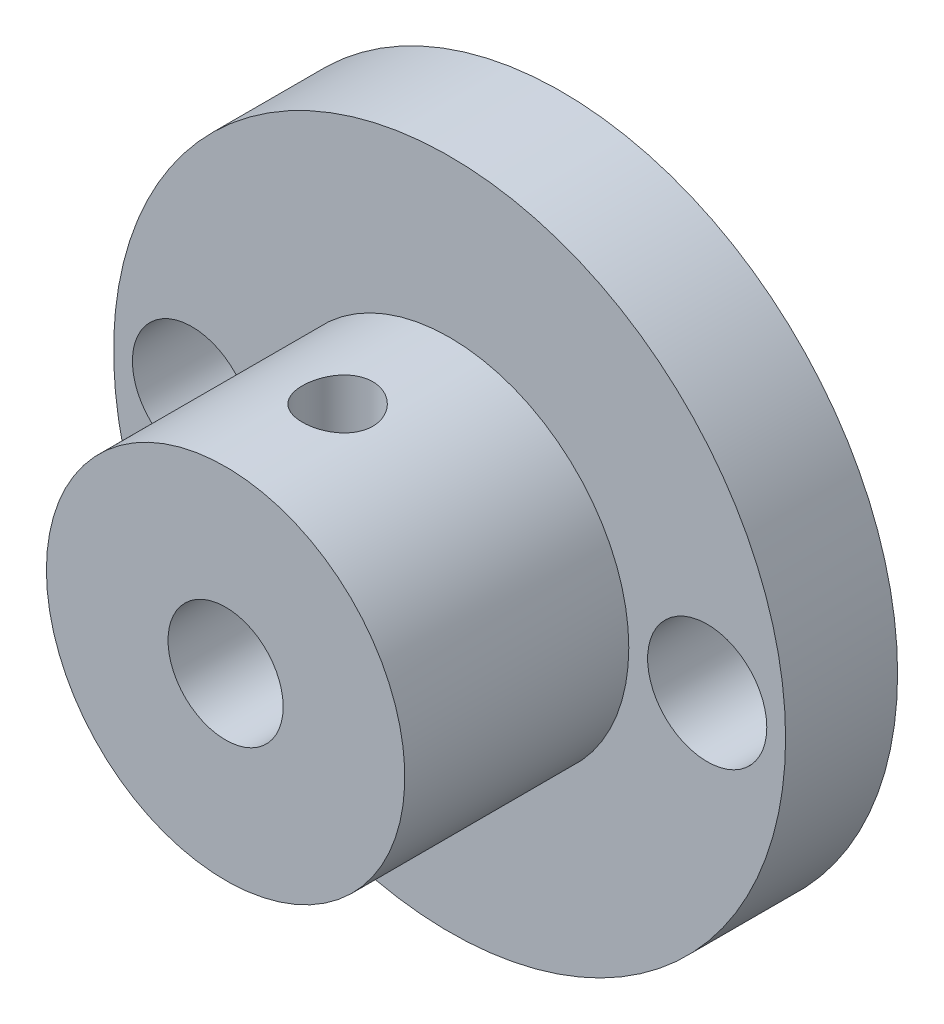
ISO-10303-21;
HEADER;
FILE_DESCRIPTION(('STEP AP214'),'2;1');
FILE_NAME('part.step','',(''),(''),'','','');
FILE_SCHEMA(('AUTOMOTIVE_DESIGN { 1 0 10303 214 1 1 1 1 }'));
ENDSEC;
DATA;
#1=APPLICATION_CONTEXT('core data for automotive mechanical design processes');
#2=APPLICATION_PROTOCOL_DEFINITION('international standard','automotive_design',2000,#1);
#3=PRODUCT_CONTEXT('',#1,'mechanical');
#4=PRODUCT('Part','Part','',(#3));
#5=PRODUCT_RELATED_PRODUCT_CATEGORY('part','',(#4));
#6=PRODUCT_DEFINITION_FORMATION('','',#4);
#7=PRODUCT_DEFINITION_CONTEXT('part definition',#1,'design');
#8=PRODUCT_DEFINITION('design','',#6,#7);
#9=PRODUCT_DEFINITION_SHAPE('','',#8);
#10=(LENGTH_UNIT() NAMED_UNIT(*) SI_UNIT(.MILLI.,.METRE.));
#11=(NAMED_UNIT(*) PLANE_ANGLE_UNIT() SI_UNIT($,.RADIAN.));
#12=(NAMED_UNIT(*) SI_UNIT($,.STERADIAN.) SOLID_ANGLE_UNIT());
#13=UNCERTAINTY_MEASURE_WITH_UNIT(LENGTH_MEASURE(1.E-05),#10,'distance_accuracy_value','');
#14=(GEOMETRIC_REPRESENTATION_CONTEXT(3) GLOBAL_UNCERTAINTY_ASSIGNED_CONTEXT((#13)) GLOBAL_UNIT_ASSIGNED_CONTEXT((#10,
#11,#12)) REPRESENTATION_CONTEXT('',''));
#15=CARTESIAN_POINT('',(0.,0.,0.));
#16=DIRECTION('',(0.,0.,1.));
#17=DIRECTION('',(1.,0.,0.));
#18=AXIS2_PLACEMENT_3D('',#15,#16,#17);
#19=CARTESIAN_POINT('',(0.,0.,6.35));
#20=DIRECTION('',(0.,0.,-1.));
#21=DIRECTION('',(-1.,0.,0.));
#22=AXIS2_PLACEMENT_3D('',#19,#20,#21);
#23=CYLINDRICAL_SURFACE('',#22,19.05);
#24=CARTESIAN_POINT('',(0.,0.,6.35));
#25=DIRECTION('',(0.,0.,1.));
#26=DIRECTION('',(1.,0.,0.));
#27=AXIS2_PLACEMENT_3D('',#24,#25,#26);
#28=CIRCLE('',#27,19.05);
#29=CARTESIAN_POINT('',(19.05,0.,6.35));
#30=VERTEX_POINT('',#29);
#31=EDGE_CURVE('E48',#30,#30,#28,.T.);
#32=ORIENTED_EDGE('',*,*,#31,.F.);
#33=EDGE_LOOP('',(#32));
#34=FACE_BOUND('',#33,.T.);
#35=CARTESIAN_POINT('',(0.,0.,0.));
#36=DIRECTION('',(0.,0.,1.));
#37=DIRECTION('',(1.,0.,0.));
#38=AXIS2_PLACEMENT_3D('',#35,#36,#37);
#39=CIRCLE('',#38,19.05);
#40=CARTESIAN_POINT('',(19.05,0.,0.));
#41=VERTEX_POINT('',#40);
#42=EDGE_CURVE('E53',#41,#41,#39,.T.);
#43=ORIENTED_EDGE('',*,*,#42,.T.);
#44=EDGE_LOOP('',(#43));
#45=FACE_BOUND('',#44,.T.);
#46=ADVANCED_FACE('F33',(#34,#45),#23,.T.);
#47=CARTESIAN_POINT('',(0.,0.,6.35));
#48=DIRECTION('',(0.,0.,1.));
#49=DIRECTION('',(1.,0.,0.));
#50=AXIS2_PLACEMENT_3D('',#47,#48,#49);
#51=PLANE('',#50);
#52=CARTESIAN_POINT('',(-14.605,0.,6.35));
#53=DIRECTION('',(0.,0.,1.));
#54=DIRECTION('',(1.,0.,0.));
#55=AXIS2_PLACEMENT_3D('',#52,#53,#54);
#56=CIRCLE('',#55,3.3782);
#57=CARTESIAN_POINT('',(-11.2268,0.,6.35));
#58=VERTEX_POINT('',#57);
#59=EDGE_CURVE('E183',#58,#58,#56,.T.);
#60=ORIENTED_EDGE('',*,*,#59,.F.);
#61=EDGE_LOOP('',(#60));
#62=FACE_BOUND('',#61,.T.);
#63=CARTESIAN_POINT('',(14.605,0.,6.35));
#64=DIRECTION('',(0.,0.,1.));
#65=DIRECTION('',(1.,0.,0.));
#66=AXIS2_PLACEMENT_3D('',#63,#64,#65);
#67=CIRCLE('',#66,3.3782);
#68=CARTESIAN_POINT('',(17.9832,0.,6.35));
#69=VERTEX_POINT('',#68);
#70=EDGE_CURVE('E187',#69,#69,#67,.T.);
#71=ORIENTED_EDGE('',*,*,#70,.F.);
#72=EDGE_LOOP('',(#71));
#73=FACE_BOUND('',#72,.T.);
#74=CARTESIAN_POINT('',(0.,0.,6.35));
#75=DIRECTION('',(0.,0.,1.));
#76=DIRECTION('',(1.,0.,0.));
#77=AXIS2_PLACEMENT_3D('',#74,#75,#76);
#78=CIRCLE('',#77,10.16);
#79=CARTESIAN_POINT('',(10.16,0.,6.35));
#80=VERTEX_POINT('',#79);
#81=EDGE_CURVE('E44',#80,#80,#78,.T.);
#82=ORIENTED_EDGE('',*,*,#81,.F.);
#83=EDGE_LOOP('',(#82));
#84=FACE_BOUND('',#83,.T.);
#85=ORIENTED_EDGE('',*,*,#31,.T.);
#86=EDGE_LOOP('',(#85));
#87=FACE_BOUND('',#86,.T.);
#88=ADVANCED_FACE('F101',(#62,#73,#84,#87),#51,.T.);
#89=CARTESIAN_POINT('',(0.,0.,0.));
#90=DIRECTION('',(0.,0.,1.));
#91=DIRECTION('',(1.,0.,0.));
#92=AXIS2_PLACEMENT_3D('',#89,#90,#91);
#93=PLANE('',#92);
#94=CARTESIAN_POINT('',(-14.605,0.,0.));
#95=DIRECTION('',(0.,0.,1.));
#96=DIRECTION('',(1.,0.,0.));
#97=AXIS2_PLACEMENT_3D('',#94,#95,#96);
#98=CIRCLE('',#97,3.3782);
#99=CARTESIAN_POINT('',(-11.2268,0.,0.));
#100=VERTEX_POINT('',#99);
#101=EDGE_CURVE('E189',#100,#100,#98,.T.);
#102=ORIENTED_EDGE('',*,*,#101,.T.);
#103=EDGE_LOOP('',(#102));
#104=FACE_BOUND('',#103,.T.);
#105=CARTESIAN_POINT('',(14.605,0.,0.));
#106=DIRECTION('',(0.,0.,1.));
#107=DIRECTION('',(1.,0.,0.));
#108=AXIS2_PLACEMENT_3D('',#105,#106,#107);
#109=CIRCLE('',#108,3.3782);
#110=CARTESIAN_POINT('',(17.9832,0.,0.));
#111=VERTEX_POINT('',#110);
#112=EDGE_CURVE('E79',#111,#111,#109,.T.);
#113=ORIENTED_EDGE('',*,*,#112,.T.);
#114=EDGE_LOOP('',(#113));
#115=FACE_BOUND('',#114,.T.);
#116=CARTESIAN_POINT('',(0.,0.,0.));
#117=DIRECTION('',(0.,0.,1.));
#118=DIRECTION('',(1.,0.,0.));
#119=AXIS2_PLACEMENT_3D('',#116,#117,#118);
#120=CIRCLE('',#119,3.2639);
#121=CARTESIAN_POINT('',(3.2639,0.,0.));
#122=VERTEX_POINT('',#121);
#123=EDGE_CURVE('E62',#122,#122,#120,.T.);
#124=ORIENTED_EDGE('',*,*,#123,.T.);
#125=EDGE_LOOP('',(#124));
#126=FACE_BOUND('',#125,.T.);
#127=ORIENTED_EDGE('',*,*,#42,.F.);
#128=EDGE_LOOP('',(#127));
#129=FACE_BOUND('',#128,.T.);
#130=ADVANCED_FACE('F106',(#104,#115,#126,#129),#93,.F.);
#131=CARTESIAN_POINT('',(0.,0.,19.05));
#132=DIRECTION('',(0.,0.,-1.));
#133=DIRECTION('',(-1.,0.,0.));
#134=AXIS2_PLACEMENT_3D('',#131,#132,#133);
#135=CYLINDRICAL_SURFACE('',#134,10.16);
#136=CARTESIAN_POINT('',(0.,10.16,14.6939));
#137=CARTESIAN_POINT('',(0.110858123263479,10.1599979650413,14.6938958716292));
#138=CARTESIAN_POINT('',(0.221768896426401,10.1581669455648,14.6846234197801));
#139=CARTESIAN_POINT('',(0.44045838983897,10.1510392198173,14.6478063490752));
#140=CARTESIAN_POINT('',(0.548234500492755,10.1457397076831,14.6202469365951));
#141=CARTESIAN_POINT('',(0.757460906159006,10.1322670855544,14.5477377183926));
#142=CARTESIAN_POINT('',(0.858917050551363,10.1240966806447,14.5028042792747));
#143=CARTESIAN_POINT('',(1.05284271944106,10.1057716970897,14.3968704801044));
#144=CARTESIAN_POINT('',(1.1453128371518,10.0956172495545,14.335871181629));
#145=CARTESIAN_POINT('',(1.31985729201079,10.0742944395148,14.1986920613211));
#146=CARTESIAN_POINT('',(1.40179730581386,10.0631156021166,14.1223429398059));
#147=CARTESIAN_POINT('',(1.55179281021232,10.0410806124938,13.9569954611241));
#148=CARTESIAN_POINT('',(1.61984724371788,10.0302244848902,13.86799614179));
#149=CARTESIAN_POINT('',(1.74070751549861,10.0099619471507,13.6789136054686));
#150=CARTESIAN_POINT('',(1.79337501657582,10.0005690234506,13.5787403913629));
#151=CARTESIAN_POINT('',(1.88108035144073,9.98444480604209,13.3707519735909));
#152=CARTESIAN_POINT('',(1.91611985856615,9.97771325971527,13.2629374963806));
#153=CARTESIAN_POINT('',(1.9671400148709,9.96777978236372,13.0441697963226));
#154=CARTESIAN_POINT('',(1.98335590551731,9.96453432437505,12.9332734519643));
#155=CARTESIAN_POINT('',(1.9969990464289,9.9618094069376,12.7102902912248));
#156=CARTESIAN_POINT('',(1.99442814511342,9.96232957699125,12.5982035930453));
#157=CARTESIAN_POINT('',(1.97076104570283,9.96703757053792,12.3777373698252));
#158=CARTESIAN_POINT('',(1.94993385027785,9.97117213431374,12.2693276608074));
#159=CARTESIAN_POINT('',(1.89076968278373,9.98255925589118,12.0575715930878));
#160=CARTESIAN_POINT('',(1.85243190261485,9.98981195759152,11.95422546831));
#161=CARTESIAN_POINT('',(1.75907607596263,10.0066729851251,11.7547513239953));
#162=CARTESIAN_POINT('',(1.70395079615589,10.0162963763683,11.6586748168326));
#163=CARTESIAN_POINT('',(1.57866048974938,10.0368047092387,11.4770345688084));
#164=CARTESIAN_POINT('',(1.50849379642712,10.047689790611,11.3914719946387));
#165=CARTESIAN_POINT('',(1.35366907574406,10.0697261718611,11.2317355897915));
#166=CARTESIAN_POINT('',(1.26878130449337,10.0808788191201,11.1577844447388));
#167=CARTESIAN_POINT('',(1.08768916672878,10.1020210449141,11.025136793673));
#168=CARTESIAN_POINT('',(0.991484665244538,10.1120106095746,10.9664404696251));
#169=CARTESIAN_POINT('',(0.790247221785284,10.1297242831502,10.8659300171265));
#170=CARTESIAN_POINT('',(0.685201605876971,10.1374450660303,10.8241406408094));
#171=CARTESIAN_POINT('',(0.46939579604783,10.14972587633,10.7588639858275));
#172=CARTESIAN_POINT('',(0.358636269803102,10.1542862721491,10.7353745739354));
#173=CARTESIAN_POINT('',(0.136460996137251,10.1596813849294,10.707678267192));
#174=CARTESIAN_POINT('',(0.0250846378176172,10.1605749997358,10.7031665128841));
#175=CARTESIAN_POINT('',(-0.196830658085823,10.1586991827899,10.7127335706164));
#176=CARTESIAN_POINT('',(-0.307369640594518,10.1559299489679,10.7268113781275));
#177=CARTESIAN_POINT('',(-0.523493954282817,10.1470763900748,10.7729046062545));
#178=CARTESIAN_POINT('',(-0.629113787919286,10.1410208639777,10.8047642660408));
#179=CARTESIAN_POINT('',(-0.833512376655158,10.1262711284486,10.8853471179695));
#180=CARTESIAN_POINT('',(-0.93229063294717,10.117576726869,10.9340715381421));
#181=CARTESIAN_POINT('',(-1.12149253445846,10.0983668872838,11.0476649791883));
#182=CARTESIAN_POINT('',(-1.21180337096727,10.0878311005688,11.1127183817045));
#183=CARTESIAN_POINT('',(-1.38033618440877,10.0661564089001,11.2568754795166));
#184=CARTESIAN_POINT('',(-1.45855691520152,10.0550174419356,11.3359806213364));
#185=CARTESIAN_POINT('',(-1.60186016279124,10.033194245425,11.5073812106582));
#186=CARTESIAN_POINT('',(-1.66673376410666,10.0225190508784,11.5998526736211));
#187=CARTESIAN_POINT('',(-1.78002789539497,10.0030204942332,11.7945594069079));
#188=CARTESIAN_POINT('',(-1.82844907036435,9.99419705954386,11.8967942942677));
#189=CARTESIAN_POINT('',(-1.90717524534429,9.97947338182904,12.1076197483964));
#190=CARTESIAN_POINT('',(-1.93757227672536,9.97355831560157,12.2161748646077));
#191=CARTESIAN_POINT('',(-1.97966792986873,9.96528892290555,12.4369797667193));
#192=CARTESIAN_POINT('',(-1.99136888820681,9.96293415148467,12.5492290891395));
#193=CARTESIAN_POINT('',(-1.99565629488217,9.96207601824634,12.7721400462659));
#194=CARTESIAN_POINT('',(-1.98857268134948,9.96350617585529,12.8827952117888));
#195=CARTESIAN_POINT('',(-1.95621841707077,9.96990856471935,13.1013041203753));
#196=CARTESIAN_POINT('',(-1.93094790053752,9.97488076983542,13.2091578841062));
#197=CARTESIAN_POINT('',(-1.86308193423556,9.9877778122724,13.4188024184541));
#198=CARTESIAN_POINT('',(-1.82052549746964,9.99569599738143,13.5206062540782));
#199=CARTESIAN_POINT('',(-1.71933301634641,10.0135968865476,13.7156809082643));
#200=CARTESIAN_POINT('',(-1.66069568797195,10.0235797554487,13.8089510446393));
#201=CARTESIAN_POINT('',(-1.52787284145226,10.0446895151,13.9859566354871));
#202=CARTESIAN_POINT('',(-1.45344847852827,10.05583246037,14.0695109812349));
#203=CARTESIAN_POINT('',(-1.29165885793015,10.0778901389193,14.2230544115798));
#204=CARTESIAN_POINT('',(-1.20429063142325,10.0888048191861,14.2930403755792));
#205=CARTESIAN_POINT('',(-1.01804331358977,10.1093048085193,14.4181198383686));
#206=CARTESIAN_POINT('',(-0.919057755680921,10.1188757173829,14.4730572557709));
#207=CARTESIAN_POINT('',(-0.713101392609697,10.1354684239324,14.5654321819454));
#208=CARTESIAN_POINT('',(-0.606137982178857,10.1424925477029,14.6028856685529));
#209=CARTESIAN_POINT('',(-0.415759229828299,10.1518149224105,14.6518679435525));
#210=CARTESIAN_POINT('',(-0.333436888528072,10.1548665575065,14.667602222542));
#211=CARTESIAN_POINT('',(-0.167419681205357,10.1589598347994,14.6886196540196));
#212=CARTESIAN_POINT('',(-0.0837248561555107,10.160001536889,14.6939031179244));
#213=CARTESIAN_POINT('',(0.,10.16,14.6939));
#214=B_SPLINE_CURVE_WITH_KNOTS('',3,(#136,#137,#138,#139,#140,#141,#142,#143,#144,#145,#146,
#147,#148,#149,#150,#151,#152,#153,#154,#155,#156,#157,#158,#159,#160,#161,#162,#163,#164,#165,
#166,#167,#168,#169,#170,#171,#172,#173,#174,#175,#176,#177,#178,#179,#180,#181,#182,#183,#184,
#185,#186,#187,#188,#189,#190,#191,#192,#193,#194,#195,#196,#197,#198,#199,#200,#201,#202,#203,
#204,#205,#206,#207,#208,#209,#210,#211,#212,#213),.UNSPECIFIED.,.T.,.F.,(4,2,2,2,2,2,2,2,2,2,2,
2,2,2,2,2,2,2,2,2,2,2,2,2,2,2,2,2,2,2,2,2,2,2,2,2,2,2,4),(0.,0.332268111168349,
0.664805345906165,0.997030085567929,1.32923287846198,1.66532335596758,2.00143941003312,
2.34049037758282,2.67950915463623,3.01424393291202,3.34894577731021,3.67879722814681,
4.00866390290731,4.34068350493294,4.67273991672107,5.01054211560188,5.34834834372954,
5.68664735318377,6.02490692120873,6.35771138752277,6.69049787072635,7.02041404013207,
7.3503542378814,7.6842022488737,8.01808464701856,8.35685090680286,8.69560388415307,
9.03261195063374,9.36957789562207,9.70066463328302,10.0317489276684,10.3620901055795,
10.6924576680532,11.0282341804987,11.3640878269495,11.7033032696749,12.0422081077483,
12.2931588544613,12.5441021231518),.UNSPECIFIED.);
#215=CARTESIAN_POINT('',(0.,10.16,14.6939));
#216=VERTEX_POINT('',#215);
#217=EDGE_CURVE('E10',#216,#216,#214,.T.);
#218=ORIENTED_EDGE('',*,*,#217,.F.);
#219=EDGE_LOOP('',(#218));
#220=FACE_BOUND('',#219,.T.);
#221=ORIENTED_EDGE('',*,*,#81,.T.);
#222=EDGE_LOOP('',(#221));
#223=FACE_BOUND('',#222,.T.);
#224=CARTESIAN_POINT('',(0.,0.,19.05));
#225=DIRECTION('',(0.,0.,-1.));
#226=DIRECTION('',(-1.,0.,0.));
#227=AXIS2_PLACEMENT_3D('',#224,#225,#226);
#228=CIRCLE('',#227,10.16);
#229=CARTESIAN_POINT('',(-10.16,0.,19.05));
#230=VERTEX_POINT('',#229);
#231=EDGE_CURVE('E56',#230,#230,#228,.T.);
#232=ORIENTED_EDGE('',*,*,#231,.T.);
#233=EDGE_LOOP('',(#232));
#234=FACE_BOUND('',#233,.T.);
#235=ADVANCED_FACE('F114',(#220,#223,#234),#135,.T.);
#236=CARTESIAN_POINT('',(0.,0.,19.05));
#237=DIRECTION('',(0.,0.,-1.));
#238=DIRECTION('',(-1.,0.,0.));
#239=AXIS2_PLACEMENT_3D('',#236,#237,#238);
#240=PLANE('',#239);
#241=CARTESIAN_POINT('',(0.,0.,19.05));
#242=DIRECTION('',(0.,0.,1.));
#243=DIRECTION('',(1.,0.,0.));
#244=AXIS2_PLACEMENT_3D('',#241,#242,#243);
#245=CIRCLE('',#244,3.2639);
#246=CARTESIAN_POINT('',(3.2639,0.,19.05));
#247=VERTEX_POINT('',#246);
#248=EDGE_CURVE('E66',#247,#247,#245,.T.);
#249=ORIENTED_EDGE('',*,*,#248,.F.);
#250=EDGE_LOOP('',(#249));
#251=FACE_BOUND('',#250,.T.);
#252=ORIENTED_EDGE('',*,*,#231,.F.);
#253=EDGE_LOOP('',(#252));
#254=FACE_BOUND('',#253,.T.);
#255=ADVANCED_FACE('F120',(#251,#254),#240,.F.);
#256=CARTESIAN_POINT('',(0.,0.,19.05));
#257=DIRECTION('',(0.,0.,1.));
#258=DIRECTION('',(1.,0.,0.));
#259=AXIS2_PLACEMENT_3D('',#256,#257,#258);
#260=CYLINDRICAL_SURFACE('',#259,3.2639);
#261=CARTESIAN_POINT('',(0.,3.2639,14.6939));
#262=CARTESIAN_POINT('',(0.101694243640138,3.26389325531924,14.6938926032186));
#263=CARTESIAN_POINT('',(0.203536941812698,3.25909587232235,14.6860656380271));
#264=CARTESIAN_POINT('',(0.40413130381376,3.24035890142403,14.6551636529329));
#265=CARTESIAN_POINT('',(0.502875564368964,3.22639894045284,14.6320546524288));
#266=CARTESIAN_POINT('',(0.693957371813329,3.1907471522951,14.5719090704772));
#267=CARTESIAN_POINT('',(0.786324037871585,3.16909368698864,14.5349415418546));
#268=CARTESIAN_POINT('',(0.963240339634351,3.11988057948823,14.4485725608853));
#269=CARTESIAN_POINT('',(1.04779143504146,3.0923220433789,14.3991734368111));
#270=CARTESIAN_POINT('',(1.21413710977215,3.03106721627736,14.2850747102484));
#271=CARTESIAN_POINT('',(1.29520259850382,2.99705988420205,14.2194823702546));
#272=CARTESIAN_POINT('',(1.44589235397792,2.92734484096397,14.076885586211));
#273=CARTESIAN_POINT('',(1.51550138740583,2.89163494598502,13.9998662024494));
#274=CARTESIAN_POINT('',(1.6503634398329,2.81709135455648,13.825010578464));
#275=CARTESIAN_POINT('',(1.71391530144616,2.77844372758778,13.7257715133739));
#276=CARTESIAN_POINT('',(1.8232220621941,2.70797879028997,13.5157518443189));
#277=CARTESIAN_POINT('',(1.86900641093119,2.67615021697113,13.4049907279707));
#278=CARTESIAN_POINT('',(1.93149008648612,2.63125163049911,13.2031810973821));
#279=CARTESIAN_POINT('',(1.95259440710578,2.61548344634356,13.1140999197569));
#280=CARTESIAN_POINT('',(1.98238357777402,2.59298284072272,12.9328136438415));
#281=CARTESIAN_POINT('',(1.99108475840957,2.58623853868793,12.8406128171853));
#282=CARTESIAN_POINT('',(1.99555690807524,2.58279048772348,12.6554970358026));
#283=CARTESIAN_POINT('',(1.99129901073212,2.58610915401565,12.5625809473393));
#284=CARTESIAN_POINT('',(1.97006950192511,2.6023137595599,12.3790432613344));
#285=CARTESIAN_POINT('',(1.95308803902867,2.61520711210353,12.2884234979963));
#286=CARTESIAN_POINT('',(1.90773816818314,2.64846029154587,12.1132920543788));
#287=CARTESIAN_POINT('',(1.87956826980533,2.66868944643558,12.0287027197621));
#288=CARTESIAN_POINT('',(1.81290579743343,2.7144145014275,11.8652481076739));
#289=CARTESIAN_POINT('',(1.77440950172941,2.73991229962519,11.7863849069905));
#290=CARTESIAN_POINT('',(1.68020324270568,2.79885158204879,11.6215191357815));
#291=CARTESIAN_POINT('',(1.62264152521472,2.83289658855656,11.536790291604));
#292=CARTESIAN_POINT('',(1.4954930247312,2.9020323386282,11.3772922134624));
#293=CARTESIAN_POINT('',(1.42589433630806,2.93712408878795,11.3025329710494));
#294=CARTESIAN_POINT('',(1.2642601492877,3.0105975101211,11.1536853325737));
#295=CARTESIAN_POINT('',(1.17042488888552,3.04868211880449,11.0813827933607));
#296=CARTESIAN_POINT('',(0.969664190477246,3.11834241484085,10.9537148906303));
#297=CARTESIAN_POINT('',(0.862745075119407,3.14992122641436,10.8983413912199));
#298=CARTESIAN_POINT('',(0.645124345977512,3.2013424992061,10.8099202638736));
#299=CARTESIAN_POINT('',(0.535028376378675,3.22177247330729,10.7757383162135));
#300=CARTESIAN_POINT('',(0.309165639009144,3.25121056790396,10.7268413298073));
#301=CARTESIAN_POINT('',(0.193406389509793,3.26023342626145,10.712101171425));
#302=CARTESIAN_POINT('',(-0.0226918809486517,3.26535376213499,10.7037216126018));
#303=CARTESIAN_POINT('',(-0.12289837030386,3.26309756631935,10.7073947799784));
#304=CARTESIAN_POINT('',(-0.321021709749807,3.24959065005142,10.7295907356679));
#305=CARTESIAN_POINT('',(-0.418938649020738,3.2383402805336,10.7481129446014));
#306=CARTESIAN_POINT('',(-0.606822342671245,3.20836390152443,10.798269084159));
#307=CARTESIAN_POINT('',(-0.696940423537243,3.18987608894318,10.8294863581661));
#308=CARTESIAN_POINT('',(-0.870608935705202,3.14691819919078,10.9037251492609));
#309=CARTESIAN_POINT('',(-0.954158160430378,3.1224470263644,10.9467488284793));
#310=CARTESIAN_POINT('',(-1.12162434331303,3.06652496218129,11.0482888639288));
#311=CARTESIAN_POINT('',(-1.20469548838672,3.03461508429203,11.1079434692504));
#312=CARTESIAN_POINT('',(-1.36026040847243,2.9681487893955,11.2386076412783));
#313=CARTESIAN_POINT('',(-1.43274184911086,2.93358935660535,11.3096302503545));
#314=CARTESIAN_POINT('',(-1.57532707662415,2.85983773432669,11.4723047628409));
#315=CARTESIAN_POINT('',(-1.64374414205295,2.8206596290454,11.5654498865994));
#316=CARTESIAN_POINT('',(-1.76409762433086,2.7469958309423,11.7635205667596));
#317=CARTESIAN_POINT('',(-1.81604901503706,2.71250589111035,11.8684353016335));
#318=CARTESIAN_POINT('',(-1.89222241315405,2.65973885363416,12.0646248769845));
#319=CARTESIAN_POINT('',(-1.92000112329015,2.63957124094452,12.1540038052399));
#320=CARTESIAN_POINT('',(-1.96286030087244,2.60786241374703,12.3371859437388));
#321=CARTESIAN_POINT('',(-1.97795944671043,2.59630851312213,12.4309824303968));
#322=CARTESIAN_POINT('',(-1.99462023050148,2.58353546659354,12.6209376020117));
#323=CARTESIAN_POINT('',(-1.99612010836542,2.58236346990665,12.7171050767923));
#324=CARTESIAN_POINT('',(-1.98530936820949,2.59068129662992,12.9082128528478));
#325=CARTESIAN_POINT('',(-1.97299224210694,2.60017614433827,13.0031525545034));
#326=CARTESIAN_POINT('',(-1.93651666363307,2.62743491919855,13.1831812867791));
#327=CARTESIAN_POINT('',(-1.9131352310762,2.64465283743551,13.2685167456712));
#328=CARTESIAN_POINT('',(-1.85592480190499,2.68510881934054,13.4340711840703));
#329=CARTESIAN_POINT('',(-1.82209176437624,2.70834921092247,13.5142881701184));
#330=CARTESIAN_POINT('',(-1.73909840256389,2.76249563527769,13.6803269642158));
#331=CARTESIAN_POINT('',(-1.68839637342864,2.7940291113562,13.7651707550096));
#332=CARTESIAN_POINT('',(-1.57552062934113,2.85920170429462,13.9259849928749));
#333=CARTESIAN_POINT('',(-1.51333741467631,2.89284254948258,14.0019480062192));
#334=CARTESIAN_POINT('',(-1.36625904576137,2.9655081280342,14.1568154520806));
#335=CARTESIAN_POINT('',(-1.27929109482279,3.00442184896719,14.2338239790086));
#336=CARTESIAN_POINT('',(-1.09193681263778,3.07747350230866,14.3723929597494));
#337=CARTESIAN_POINT('',(-0.991544304325277,3.11160922131833,14.4339462643772));
#338=CARTESIAN_POINT('',(-0.781104046417249,3.17089798008227,14.5382061736422));
#339=CARTESIAN_POINT('',(-0.671256581577805,3.1961981012443,14.5812244705605));
#340=CARTESIAN_POINT('',(-0.501010574904513,3.22573578794909,14.6308367166957));
#341=CARTESIAN_POINT('',(-0.443410227859829,3.23417531821784,14.6448815975236));
#342=CARTESIAN_POINT('',(-0.326850804517473,3.2480211308007,14.6678216621779));
#343=CARTESIAN_POINT('',(-0.267892843235901,3.25342981592601,14.6767209255558));
#344=CARTESIAN_POINT('',(-0.173978725197223,3.2594445568768,14.686600174408));
#345=CARTESIAN_POINT('',(-0.139262975458325,3.26111276362336,14.6893349557103));
#346=CARTESIAN_POINT('',(-0.0697039698600402,3.26334166997877,14.6929861835276));
#347=CARTESIAN_POINT('',(-0.0348607074729938,3.2639023120713,14.6939025356109));
#348=CARTESIAN_POINT('',(0.,3.2639,14.6939));
#349=B_SPLINE_CURVE_WITH_KNOTS('',3,(#261,#262,#263,#264,#265,#266,#267,#268,#269,#270,#271,
#272,#273,#274,#275,#276,#277,#278,#279,#280,#281,#282,#283,#284,#285,#286,#287,#288,#289,#290,
#291,#292,#293,#294,#295,#296,#297,#298,#299,#300,#301,#302,#303,#304,#305,#306,#307,#308,#309,
#310,#311,#312,#313,#314,#315,#316,#317,#318,#319,#320,#321,#322,#323,#324,#325,#326,#327,#328,
#329,#330,#331,#332,#333,#334,#335,#336,#337,#338,#339,#340,#341,#342,#343,#344,#345,#346,#347,
#348),.UNSPECIFIED.,.T.,.F.,(4,2,2,2,2,2,2,2,2,2,2,2,2,2,2,2,2,2,2,2,2,2,2,2,2,2,2,2,2,2,2,2,2,
2,2,2,2,2,2,2,2,2,2,4),(0.,0.304941382384372,0.610563112026259,0.91468183609009,
1.21874364509573,1.54651604842846,1.87472082034964,2.24498185734241,2.61462653940915,
2.89214138658242,3.16929050542392,3.44705742598659,3.72503963474449,3.99829559152458,
4.27165016440042,4.59425541868147,4.91718159687911,5.28859067770517,5.65982098218383,
6.00891667468423,6.35756087710612,6.65693769032056,6.95630282302741,7.24654743426335,
7.53684523409012,7.85699740998034,8.17751956058075,8.54196158652775,8.90607123218766,
9.19214304702665,9.47779270368208,9.76473897134615,10.0518204531605,10.3211993203725,
10.5906824684316,10.9007897375586,11.2111547536054,11.5769275802781,11.9428692935498,
12.3023911142785,12.4817908321392,12.6610481224906,12.7655763626861,12.8701100309371),.UNSPECIFIED.);
#350=CARTESIAN_POINT('',(0.,3.2639,14.6939));
#351=VERTEX_POINT('',#350);
#352=EDGE_CURVE('E70',#351,#351,#349,.T.);
#353=ORIENTED_EDGE('',*,*,#352,.T.);
#354=EDGE_LOOP('',(#353));
#355=FACE_BOUND('',#354,.T.);
#356=ORIENTED_EDGE('',*,*,#123,.F.);
#357=EDGE_LOOP('',(#356));
#358=FACE_BOUND('',#357,.T.);
#359=ORIENTED_EDGE('',*,*,#248,.T.);
#360=EDGE_LOOP('',(#359));
#361=FACE_BOUND('',#360,.T.);
#362=ADVANCED_FACE('F81',(#355,#358,#361),#260,.F.);
#363=CARTESIAN_POINT('',(0.,10.16,12.7));
#364=DIRECTION('',(0.,1.,0.));
#365=DIRECTION('',(0.,0.,1.));
#366=AXIS2_PLACEMENT_3D('',#363,#364,#365);
#367=CYLINDRICAL_SURFACE('',#366,1.99389999999999);
#368=ORIENTED_EDGE('',*,*,#217,.T.);
#369=EDGE_LOOP('',(#368));
#370=FACE_BOUND('',#369,.T.);
#371=ORIENTED_EDGE('',*,*,#352,.F.);
#372=EDGE_LOOP('',(#371));
#373=FACE_BOUND('',#372,.T.);
#374=ADVANCED_FACE('F84',(#370,#373),#367,.F.);
#375=CARTESIAN_POINT('',(14.605,0.,6.35));
#376=DIRECTION('',(0.,0.,1.));
#377=DIRECTION('',(1.,0.,0.));
#378=AXIS2_PLACEMENT_3D('',#375,#376,#377);
#379=CYLINDRICAL_SURFACE('',#378,3.3782);
#380=ORIENTED_EDGE('',*,*,#112,.F.);
#381=EDGE_LOOP('',(#380));
#382=FACE_BOUND('',#381,.T.);
#383=ORIENTED_EDGE('',*,*,#70,.T.);
#384=EDGE_LOOP('',(#383));
#385=FACE_BOUND('',#384,.T.);
#386=ADVANCED_FACE('F88',(#382,#385),#379,.F.);
#387=CARTESIAN_POINT('',(-14.605,0.,6.35));
#388=DIRECTION('',(0.,0.,1.));
#389=DIRECTION('',(1.,0.,0.));
#390=AXIS2_PLACEMENT_3D('',#387,#388,#389);
#391=CYLINDRICAL_SURFACE('',#390,3.3782);
#392=ORIENTED_EDGE('',*,*,#101,.F.);
#393=EDGE_LOOP('',(#392));
#394=FACE_BOUND('',#393,.T.);
#395=ORIENTED_EDGE('',*,*,#59,.T.);
#396=EDGE_LOOP('',(#395));
#397=FACE_BOUND('',#396,.T.);
#398=ADVANCED_FACE('F92',(#394,#397),#391,.F.);
#399=CLOSED_SHELL('',(#46,#88,#130,#235,#255,#362,#374,#386,#398));
#400=MANIFOLD_SOLID_BREP('B2',#399);
#401=ADVANCED_BREP_SHAPE_REPRESENTATION('',(#18,#400),#14);
#402=SHAPE_DEFINITION_REPRESENTATION(#9,#401);
ENDSEC;
END-ISO-10303-21;
